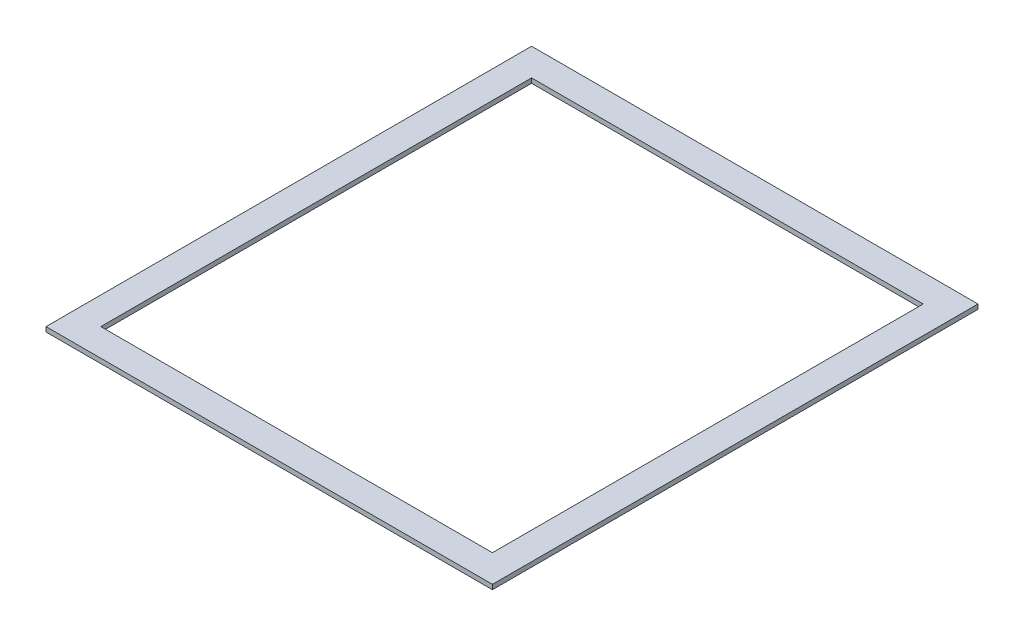
ISO-10303-21;
HEADER;
FILE_DESCRIPTION(('STEP AP214'),'2;1');
FILE_NAME('part.step','',(''),(''),'','','');
FILE_SCHEMA(('AUTOMOTIVE_DESIGN { 1 0 10303 214 1 1 1 1 }'));
ENDSEC;
DATA;
#1=APPLICATION_CONTEXT('core data for automotive mechanical design processes');
#2=APPLICATION_PROTOCOL_DEFINITION('international standard','automotive_design',2000,#1);
#3=PRODUCT_CONTEXT('',#1,'mechanical');
#4=PRODUCT('Part','Part','',(#3));
#5=PRODUCT_RELATED_PRODUCT_CATEGORY('part','',(#4));
#6=PRODUCT_DEFINITION_FORMATION('','',#4);
#7=PRODUCT_DEFINITION_CONTEXT('part definition',#1,'design');
#8=PRODUCT_DEFINITION('design','',#6,#7);
#9=PRODUCT_DEFINITION_SHAPE('','',#8);
#10=(LENGTH_UNIT() NAMED_UNIT(*) SI_UNIT(.MILLI.,.METRE.));
#11=(NAMED_UNIT(*) PLANE_ANGLE_UNIT() SI_UNIT($,.RADIAN.));
#12=(NAMED_UNIT(*) SI_UNIT($,.STERADIAN.) SOLID_ANGLE_UNIT());
#13=UNCERTAINTY_MEASURE_WITH_UNIT(LENGTH_MEASURE(1.E-05),#10,'distance_accuracy_value','');
#14=(GEOMETRIC_REPRESENTATION_CONTEXT(3) GLOBAL_UNCERTAINTY_ASSIGNED_CONTEXT((#13)) GLOBAL_UNIT_ASSIGNED_CONTEXT((#10,
#11,#12)) REPRESENTATION_CONTEXT('',''));
#15=CARTESIAN_POINT('',(0.,0.,0.));
#16=DIRECTION('',(0.,0.,1.));
#17=DIRECTION('',(1.,0.,0.));
#18=AXIS2_PLACEMENT_3D('',#15,#16,#17);
#19=CARTESIAN_POINT('',(0.,0.6,0.));
#20=DIRECTION('',(0.,1.,0.));
#21=DIRECTION('',(0.,0.,1.));
#22=AXIS2_PLACEMENT_3D('',#19,#20,#21);
#23=PLANE('',#22);
#24=DIRECTION('',(0.,0.,-1.));
#25=VECTOR('',#24,1.);
#26=CARTESIAN_POINT('',(28.5,0.6,-31.));
#27=LINE('',#26,#25);
#28=CARTESIAN_POINT('',(28.5,0.6,31.));
#29=VERTEX_POINT('',#28);
#30=CARTESIAN_POINT('',(28.5,0.6,-31.));
#31=VERTEX_POINT('',#30);
#32=EDGE_CURVE('E139',#29,#31,#27,.T.);
#33=ORIENTED_EDGE('',*,*,#32,.T.);
#34=DIRECTION('',(-1.,0.,0.));
#35=VECTOR('',#34,1.);
#36=CARTESIAN_POINT('',(-28.5,0.6,-31.));
#37=LINE('',#36,#35);
#38=CARTESIAN_POINT('',(-28.5,0.6,-31.));
#39=VERTEX_POINT('',#38);
#40=EDGE_CURVE('E142',#31,#39,#37,.T.);
#41=ORIENTED_EDGE('',*,*,#40,.T.);
#42=DIRECTION('',(0.,0.,1.));
#43=VECTOR('',#42,1.);
#44=CARTESIAN_POINT('',(-28.5,0.6,-31.));
#45=LINE('',#44,#43);
#46=CARTESIAN_POINT('',(-28.5,0.6,31.));
#47=VERTEX_POINT('',#46);
#48=EDGE_CURVE('E147',#39,#47,#45,.T.);
#49=ORIENTED_EDGE('',*,*,#48,.T.);
#50=DIRECTION('',(1.,0.,0.));
#51=VECTOR('',#50,1.);
#52=CARTESIAN_POINT('',(-28.5,0.6,31.));
#53=LINE('',#52,#51);
#54=EDGE_CURVE('E149',#47,#29,#53,.T.);
#55=ORIENTED_EDGE('',*,*,#54,.T.);
#56=EDGE_LOOP('',(#33,#41,#49,#55));
#57=FACE_BOUND('',#56,.T.);
#58=DIRECTION('',(-1.,0.,0.));
#59=VECTOR('',#58,1.);
#60=CARTESIAN_POINT('',(-25.,0.6,-27.5));
#61=LINE('',#60,#59);
#62=CARTESIAN_POINT('',(25.,0.6,-27.5));
#63=VERTEX_POINT('',#62);
#64=CARTESIAN_POINT('',(-25.,0.6,-27.5));
#65=VERTEX_POINT('',#64);
#66=EDGE_CURVE('E115',#63,#65,#61,.T.);
#67=ORIENTED_EDGE('',*,*,#66,.F.);
#68=DIRECTION('',(0.,0.,-1.));
#69=VECTOR('',#68,1.);
#70=CARTESIAN_POINT('',(25.,0.6,27.5));
#71=LINE('',#70,#69);
#72=CARTESIAN_POINT('',(25.,0.6,27.5));
#73=VERTEX_POINT('',#72);
#74=EDGE_CURVE('E101',#73,#63,#71,.T.);
#75=ORIENTED_EDGE('',*,*,#74,.F.);
#76=DIRECTION('',(1.,0.,0.));
#77=VECTOR('',#76,1.);
#78=CARTESIAN_POINT('',(-25.,0.6,27.5));
#79=LINE('',#78,#77);
#80=CARTESIAN_POINT('',(-25.,0.6,27.5));
#81=VERTEX_POINT('',#80);
#82=EDGE_CURVE('E128',#81,#73,#79,.T.);
#83=ORIENTED_EDGE('',*,*,#82,.F.);
#84=DIRECTION('',(0.,0.,1.));
#85=VECTOR('',#84,1.);
#86=CARTESIAN_POINT('',(-25.,0.6,27.5));
#87=LINE('',#86,#85);
#88=EDGE_CURVE('E125',#65,#81,#87,.T.);
#89=ORIENTED_EDGE('',*,*,#88,.F.);
#90=EDGE_LOOP('',(#67,#75,#83,#89));
#91=FACE_BOUND('',#90,.T.);
#92=ADVANCED_FACE('F39',(#57,#91),#23,.T.);
#93=CARTESIAN_POINT('',(0.,0.,0.));
#94=DIRECTION('',(0.,1.,0.));
#95=DIRECTION('',(0.,0.,1.));
#96=AXIS2_PLACEMENT_3D('',#93,#94,#95);
#97=PLANE('',#96);
#98=DIRECTION('',(0.,0.,-1.));
#99=VECTOR('',#98,1.);
#100=CARTESIAN_POINT('',(28.5,0.,-31.));
#101=LINE('',#100,#99);
#102=CARTESIAN_POINT('',(28.5,0.,31.));
#103=VERTEX_POINT('',#102);
#104=CARTESIAN_POINT('',(28.5,0.,-31.));
#105=VERTEX_POINT('',#104);
#106=EDGE_CURVE('E118',#103,#105,#101,.T.);
#107=ORIENTED_EDGE('',*,*,#106,.F.);
#108=DIRECTION('',(1.,0.,0.));
#109=VECTOR('',#108,1.);
#110=CARTESIAN_POINT('',(-28.5,0.,31.));
#111=LINE('',#110,#109);
#112=CARTESIAN_POINT('',(-28.5,0.,31.));
#113=VERTEX_POINT('',#112);
#114=EDGE_CURVE('E143',#113,#103,#111,.T.);
#115=ORIENTED_EDGE('',*,*,#114,.F.);
#116=DIRECTION('',(0.,0.,1.));
#117=VECTOR('',#116,1.);
#118=CARTESIAN_POINT('',(-28.5,0.,-31.));
#119=LINE('',#118,#117);
#120=CARTESIAN_POINT('',(-28.5,0.,-31.));
#121=VERTEX_POINT('',#120);
#122=EDGE_CURVE('E153',#121,#113,#119,.T.);
#123=ORIENTED_EDGE('',*,*,#122,.F.);
#124=DIRECTION('',(-1.,0.,0.));
#125=VECTOR('',#124,1.);
#126=CARTESIAN_POINT('',(-28.5,0.,-31.));
#127=LINE('',#126,#125);
#128=EDGE_CURVE('E155',#105,#121,#127,.T.);
#129=ORIENTED_EDGE('',*,*,#128,.F.);
#130=EDGE_LOOP('',(#107,#115,#123,#129));
#131=FACE_BOUND('',#130,.T.);
#132=DIRECTION('',(0.,0.,-1.));
#133=VECTOR('',#132,1.);
#134=CARTESIAN_POINT('',(25.,0.,27.5));
#135=LINE('',#134,#133);
#136=CARTESIAN_POINT('',(25.,0.,27.5));
#137=VERTEX_POINT('',#136);
#138=CARTESIAN_POINT('',(25.,0.,-27.5));
#139=VERTEX_POINT('',#138);
#140=EDGE_CURVE('E64',#137,#139,#135,.T.);
#141=ORIENTED_EDGE('',*,*,#140,.T.);
#142=DIRECTION('',(-1.,0.,0.));
#143=VECTOR('',#142,1.);
#144=CARTESIAN_POINT('',(-25.,0.,-27.5));
#145=LINE('',#144,#143);
#146=CARTESIAN_POINT('',(-25.,0.,-27.5));
#147=VERTEX_POINT('',#146);
#148=EDGE_CURVE('E116',#139,#147,#145,.T.);
#149=ORIENTED_EDGE('',*,*,#148,.T.);
#150=DIRECTION('',(0.,0.,1.));
#151=VECTOR('',#150,1.);
#152=CARTESIAN_POINT('',(-25.,0.,27.5));
#153=LINE('',#152,#151);
#154=CARTESIAN_POINT('',(-25.,0.,27.5));
#155=VERTEX_POINT('',#154);
#156=EDGE_CURVE('E135',#147,#155,#153,.T.);
#157=ORIENTED_EDGE('',*,*,#156,.T.);
#158=DIRECTION('',(1.,0.,0.));
#159=VECTOR('',#158,1.);
#160=CARTESIAN_POINT('',(-25.,0.,27.5));
#161=LINE('',#160,#159);
#162=EDGE_CURVE('E111',#155,#137,#161,.T.);
#163=ORIENTED_EDGE('',*,*,#162,.T.);
#164=EDGE_LOOP('',(#141,#149,#157,#163));
#165=FACE_BOUND('',#164,.T.);
#166=ADVANCED_FACE('F171',(#131,#165),#97,.F.);
#167=CARTESIAN_POINT('',(28.5,0.6,-31.));
#168=DIRECTION('',(-1.,0.,0.));
#169=DIRECTION('',(0.,0.,1.));
#170=AXIS2_PLACEMENT_3D('',#167,#168,#169);
#171=PLANE('',#170);
#172=ORIENTED_EDGE('',*,*,#106,.T.);
#173=DIRECTION('',(0.,-1.,0.));
#174=VECTOR('',#173,1.);
#175=CARTESIAN_POINT('',(28.5,0.6,-31.));
#176=LINE('',#175,#174);
#177=EDGE_CURVE('E11',#31,#105,#176,.T.);
#178=ORIENTED_EDGE('',*,*,#177,.F.);
#179=ORIENTED_EDGE('',*,*,#32,.F.);
#180=DIRECTION('',(0.,-1.,0.));
#181=VECTOR('',#180,1.);
#182=CARTESIAN_POINT('',(28.5,0.6,31.));
#183=LINE('',#182,#181);
#184=EDGE_CURVE('E148',#29,#103,#183,.T.);
#185=ORIENTED_EDGE('',*,*,#184,.T.);
#186=EDGE_LOOP('',(#172,#178,#179,#185));
#187=FACE_BOUND('',#186,.T.);
#188=ADVANCED_FACE('F41',(#187),#171,.F.);
#189=CARTESIAN_POINT('',(-28.5,0.6,-31.));
#190=DIRECTION('',(0.,0.,1.));
#191=DIRECTION('',(1.,0.,0.));
#192=AXIS2_PLACEMENT_3D('',#189,#190,#191);
#193=PLANE('',#192);
#194=ORIENTED_EDGE('',*,*,#128,.T.);
#195=DIRECTION('',(0.,-1.,0.));
#196=VECTOR('',#195,1.);
#197=CARTESIAN_POINT('',(-28.5,0.6,-31.));
#198=LINE('',#197,#196);
#199=EDGE_CURVE('E50',#39,#121,#198,.T.);
#200=ORIENTED_EDGE('',*,*,#199,.F.);
#201=ORIENTED_EDGE('',*,*,#40,.F.);
#202=ORIENTED_EDGE('',*,*,#177,.T.);
#203=EDGE_LOOP('',(#194,#200,#201,#202));
#204=FACE_BOUND('',#203,.T.);
#205=ADVANCED_FACE('F183',(#204),#193,.F.);
#206=CARTESIAN_POINT('',(-28.5,0.6,-31.));
#207=DIRECTION('',(1.,0.,0.));
#208=DIRECTION('',(0.,0.,-1.));
#209=AXIS2_PLACEMENT_3D('',#206,#207,#208);
#210=PLANE('',#209);
#211=ORIENTED_EDGE('',*,*,#122,.T.);
#212=DIRECTION('',(0.,-1.,0.));
#213=VECTOR('',#212,1.);
#214=CARTESIAN_POINT('',(-28.5,0.6,31.));
#215=LINE('',#214,#213);
#216=EDGE_CURVE('E158',#47,#113,#215,.T.);
#217=ORIENTED_EDGE('',*,*,#216,.F.);
#218=ORIENTED_EDGE('',*,*,#48,.F.);
#219=ORIENTED_EDGE('',*,*,#199,.T.);
#220=EDGE_LOOP('',(#211,#217,#218,#219));
#221=FACE_BOUND('',#220,.T.);
#222=ADVANCED_FACE('F167',(#221),#210,.F.);
#223=CARTESIAN_POINT('',(-28.5,0.6,31.));
#224=DIRECTION('',(0.,0.,-1.));
#225=DIRECTION('',(-1.,0.,0.));
#226=AXIS2_PLACEMENT_3D('',#223,#224,#225);
#227=PLANE('',#226);
#228=ORIENTED_EDGE('',*,*,#114,.T.);
#229=ORIENTED_EDGE('',*,*,#184,.F.);
#230=ORIENTED_EDGE('',*,*,#54,.F.);
#231=ORIENTED_EDGE('',*,*,#216,.T.);
#232=EDGE_LOOP('',(#228,#229,#230,#231));
#233=FACE_BOUND('',#232,.T.);
#234=ADVANCED_FACE('F180',(#233),#227,.F.);
#235=CARTESIAN_POINT('',(25.,0.6,27.5));
#236=DIRECTION('',(-1.,0.,0.));
#237=DIRECTION('',(0.,0.,1.));
#238=AXIS2_PLACEMENT_3D('',#235,#236,#237);
#239=PLANE('',#238);
#240=ORIENTED_EDGE('',*,*,#140,.F.);
#241=DIRECTION('',(0.,-1.,0.));
#242=VECTOR('',#241,1.);
#243=CARTESIAN_POINT('',(25.,0.6,27.5));
#244=LINE('',#243,#242);
#245=EDGE_CURVE('E110',#73,#137,#244,.T.);
#246=ORIENTED_EDGE('',*,*,#245,.F.);
#247=ORIENTED_EDGE('',*,*,#74,.T.);
#248=DIRECTION('',(0.,-1.,0.));
#249=VECTOR('',#248,1.);
#250=CARTESIAN_POINT('',(25.,0.6,-27.5));
#251=LINE('',#250,#249);
#252=EDGE_CURVE('E109',#63,#139,#251,.T.);
#253=ORIENTED_EDGE('',*,*,#252,.T.);
#254=EDGE_LOOP('',(#240,#246,#247,#253));
#255=FACE_BOUND('',#254,.T.);
#256=ADVANCED_FACE('F107',(#255),#239,.T.);
#257=CARTESIAN_POINT('',(-25.,0.6,-27.5));
#258=DIRECTION('',(0.,0.,1.));
#259=DIRECTION('',(1.,0.,0.));
#260=AXIS2_PLACEMENT_3D('',#257,#258,#259);
#261=PLANE('',#260);
#262=ORIENTED_EDGE('',*,*,#148,.F.);
#263=ORIENTED_EDGE('',*,*,#252,.F.);
#264=ORIENTED_EDGE('',*,*,#66,.T.);
#265=DIRECTION('',(0.,-1.,0.));
#266=VECTOR('',#265,1.);
#267=CARTESIAN_POINT('',(-25.,0.6,-27.5));
#268=LINE('',#267,#266);
#269=EDGE_CURVE('E123',#65,#147,#268,.T.);
#270=ORIENTED_EDGE('',*,*,#269,.T.);
#271=EDGE_LOOP('',(#262,#263,#264,#270));
#272=FACE_BOUND('',#271,.T.);
#273=ADVANCED_FACE('F117',(#272),#261,.T.);
#274=CARTESIAN_POINT('',(-25.,0.6,27.5));
#275=DIRECTION('',(1.,0.,0.));
#276=DIRECTION('',(0.,0.,-1.));
#277=AXIS2_PLACEMENT_3D('',#274,#275,#276);
#278=PLANE('',#277);
#279=ORIENTED_EDGE('',*,*,#156,.F.);
#280=ORIENTED_EDGE('',*,*,#269,.F.);
#281=ORIENTED_EDGE('',*,*,#88,.T.);
#282=DIRECTION('',(0.,-1.,0.));
#283=VECTOR('',#282,1.);
#284=CARTESIAN_POINT('',(-25.,0.6,27.5));
#285=LINE('',#284,#283);
#286=EDGE_CURVE('E53',#81,#155,#285,.T.);
#287=ORIENTED_EDGE('',*,*,#286,.T.);
#288=EDGE_LOOP('',(#279,#280,#281,#287));
#289=FACE_BOUND('',#288,.T.);
#290=ADVANCED_FACE('F207',(#289),#278,.T.);
#291=CARTESIAN_POINT('',(-25.,0.6,27.5));
#292=DIRECTION('',(0.,0.,-1.));
#293=DIRECTION('',(-1.,0.,0.));
#294=AXIS2_PLACEMENT_3D('',#291,#292,#293);
#295=PLANE('',#294);
#296=ORIENTED_EDGE('',*,*,#162,.F.);
#297=ORIENTED_EDGE('',*,*,#286,.F.);
#298=ORIENTED_EDGE('',*,*,#82,.T.);
#299=ORIENTED_EDGE('',*,*,#245,.T.);
#300=EDGE_LOOP('',(#296,#297,#298,#299));
#301=FACE_BOUND('',#300,.T.);
#302=ADVANCED_FACE('F208',(#301),#295,.T.);
#303=CLOSED_SHELL('',(#92,#166,#188,#205,#222,#234,#256,#273,#290,#302));
#304=MANIFOLD_SOLID_BREP('B2',#303);
#305=ADVANCED_BREP_SHAPE_REPRESENTATION('',(#18,#304),#14);
#306=SHAPE_DEFINITION_REPRESENTATION(#9,#305);
ENDSEC;
END-ISO-10303-21;
